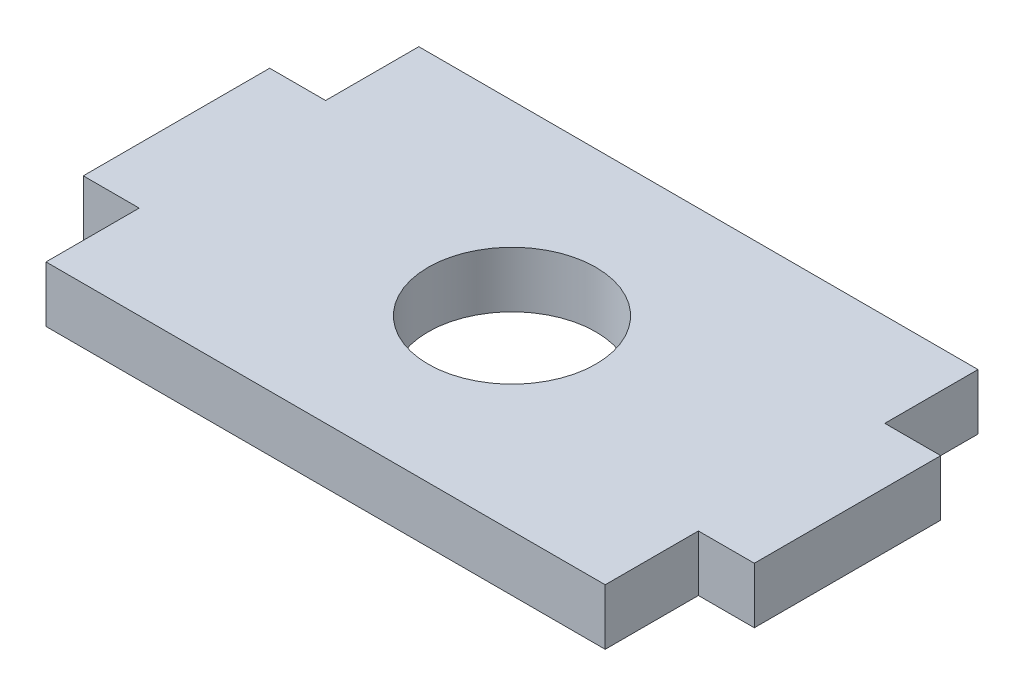
ISO-10303-21;
HEADER;
FILE_DESCRIPTION(('STEP AP214'),'2;1');
FILE_NAME('part.step','',(''),(''),'','','');
FILE_SCHEMA(('AUTOMOTIVE_DESIGN { 1 0 10303 214 1 1 1 1 }'));
ENDSEC;
DATA;
#1=APPLICATION_CONTEXT('core data for automotive mechanical design processes');
#2=APPLICATION_PROTOCOL_DEFINITION('international standard','automotive_design',2000,#1);
#3=PRODUCT_CONTEXT('',#1,'mechanical');
#4=PRODUCT('Part','Part','',(#3));
#5=PRODUCT_RELATED_PRODUCT_CATEGORY('part','',(#4));
#6=PRODUCT_DEFINITION_FORMATION('','',#4);
#7=PRODUCT_DEFINITION_CONTEXT('part definition',#1,'design');
#8=PRODUCT_DEFINITION('design','',#6,#7);
#9=PRODUCT_DEFINITION_SHAPE('','',#8);
#10=(LENGTH_UNIT() NAMED_UNIT(*) SI_UNIT(.MILLI.,.METRE.));
#11=(NAMED_UNIT(*) PLANE_ANGLE_UNIT() SI_UNIT($,.RADIAN.));
#12=(NAMED_UNIT(*) SI_UNIT($,.STERADIAN.) SOLID_ANGLE_UNIT());
#13=UNCERTAINTY_MEASURE_WITH_UNIT(LENGTH_MEASURE(1.E-05),#10,'distance_accuracy_value','');
#14=(GEOMETRIC_REPRESENTATION_CONTEXT(3) GLOBAL_UNCERTAINTY_ASSIGNED_CONTEXT((#13)) GLOBAL_UNIT_ASSIGNED_CONTEXT((#10,
#11,#12)) REPRESENTATION_CONTEXT('',''));
#15=CARTESIAN_POINT('',(0.,0.,0.));
#16=DIRECTION('',(0.,0.,1.));
#17=DIRECTION('',(1.,0.,0.));
#18=AXIS2_PLACEMENT_3D('',#15,#16,#17);
#19=CARTESIAN_POINT('',(0.,3.,0.));
#20=DIRECTION('',(0.,1.,0.));
#21=DIRECTION('',(0.,0.,1.));
#22=AXIS2_PLACEMENT_3D('',#19,#20,#21);
#23=PLANE('',#22);
#24=DIRECTION('',(-1.,0.,0.));
#25=VECTOR('',#24,1.);
#26=CARTESIAN_POINT('',(0.,3.,-5.));
#27=LINE('',#26,#25);
#28=CARTESIAN_POINT('',(3.,3.,-5.));
#29=VERTEX_POINT('',#28);
#30=CARTESIAN_POINT('',(0.,3.,-5.));
#31=VERTEX_POINT('',#30);
#32=EDGE_CURVE('E177',#29,#31,#27,.T.);
#33=ORIENTED_EDGE('',*,*,#32,.T.);
#34=DIRECTION('',(0.,0.,1.));
#35=VECTOR('',#34,1.);
#36=CARTESIAN_POINT('',(0.,3.,5.));
#37=LINE('',#36,#35);
#38=CARTESIAN_POINT('',(0.,3.,5.));
#39=VERTEX_POINT('',#38);
#40=EDGE_CURVE('E105',#31,#39,#37,.T.);
#41=ORIENTED_EDGE('',*,*,#40,.T.);
#42=DIRECTION('',(1.,0.,0.));
#43=VECTOR('',#42,1.);
#44=CARTESIAN_POINT('',(0.,3.,5.));
#45=LINE('',#44,#43);
#46=CARTESIAN_POINT('',(3.,3.,5.));
#47=VERTEX_POINT('',#46);
#48=EDGE_CURVE('E204',#39,#47,#45,.T.);
#49=ORIENTED_EDGE('',*,*,#48,.T.);
#50=DIRECTION('',(0.,0.,1.));
#51=VECTOR('',#50,1.);
#52=CARTESIAN_POINT('',(3.,3.,5.));
#53=LINE('',#52,#51);
#54=CARTESIAN_POINT('',(3.,3.,10.));
#55=VERTEX_POINT('',#54);
#56=EDGE_CURVE('E223',#47,#55,#53,.T.);
#57=ORIENTED_EDGE('',*,*,#56,.T.);
#58=DIRECTION('',(1.,0.,0.));
#59=VECTOR('',#58,1.);
#60=CARTESIAN_POINT('',(3.,3.,10.));
#61=LINE('',#60,#59);
#62=CARTESIAN_POINT('',(33.,3.,10.));
#63=VERTEX_POINT('',#62);
#64=EDGE_CURVE('E220',#55,#63,#61,.T.);
#65=ORIENTED_EDGE('',*,*,#64,.T.);
#66=DIRECTION('',(0.,0.,-1.));
#67=VECTOR('',#66,1.);
#68=CARTESIAN_POINT('',(33.,3.,5.));
#69=LINE('',#68,#67);
#70=CARTESIAN_POINT('',(33.,3.,5.));
#71=VERTEX_POINT('',#70);
#72=EDGE_CURVE('E222',#63,#71,#69,.T.);
#73=ORIENTED_EDGE('',*,*,#72,.T.);
#74=DIRECTION('',(1.,0.,0.));
#75=VECTOR('',#74,1.);
#76=CARTESIAN_POINT('',(36.,3.,5.));
#77=LINE('',#76,#75);
#78=CARTESIAN_POINT('',(36.,3.,5.));
#79=VERTEX_POINT('',#78);
#80=EDGE_CURVE('E225',#71,#79,#77,.T.);
#81=ORIENTED_EDGE('',*,*,#80,.T.);
#82=DIRECTION('',(0.,0.,-1.));
#83=VECTOR('',#82,1.);
#84=CARTESIAN_POINT('',(36.,3.,5.));
#85=LINE('',#84,#83);
#86=CARTESIAN_POINT('',(36.,3.,-5.));
#87=VERTEX_POINT('',#86);
#88=EDGE_CURVE('E231',#79,#87,#85,.T.);
#89=ORIENTED_EDGE('',*,*,#88,.T.);
#90=DIRECTION('',(-1.,0.,0.));
#91=VECTOR('',#90,1.);
#92=CARTESIAN_POINT('',(36.,3.,-5.));
#93=LINE('',#92,#91);
#94=CARTESIAN_POINT('',(33.,3.,-5.));
#95=VERTEX_POINT('',#94);
#96=EDGE_CURVE('E136',#87,#95,#93,.T.);
#97=ORIENTED_EDGE('',*,*,#96,.T.);
#98=DIRECTION('',(0.,0.,-1.));
#99=VECTOR('',#98,1.);
#100=CARTESIAN_POINT('',(33.,3.,-5.));
#101=LINE('',#100,#99);
#102=CARTESIAN_POINT('',(33.,3.,-10.));
#103=VERTEX_POINT('',#102);
#104=EDGE_CURVE('E130',#95,#103,#101,.T.);
#105=ORIENTED_EDGE('',*,*,#104,.T.);
#106=DIRECTION('',(-1.,0.,0.));
#107=VECTOR('',#106,1.);
#108=CARTESIAN_POINT('',(3.,3.,-10.));
#109=LINE('',#108,#107);
#110=CARTESIAN_POINT('',(3.,3.,-10.));
#111=VERTEX_POINT('',#110);
#112=EDGE_CURVE('E134',#103,#111,#109,.T.);
#113=ORIENTED_EDGE('',*,*,#112,.T.);
#114=DIRECTION('',(0.,0.,1.));
#115=VECTOR('',#114,1.);
#116=CARTESIAN_POINT('',(3.,3.,-5.));
#117=LINE('',#116,#115);
#118=EDGE_CURVE('E50',#111,#29,#117,.T.);
#119=ORIENTED_EDGE('',*,*,#118,.T.);
#120=EDGE_LOOP('',(#33,#41,#49,#57,#65,#73,#81,#89,#97,#105,#113,#119));
#121=FACE_BOUND('',#120,.T.);
#122=CARTESIAN_POINT('',(18.,3.,0.));
#123=DIRECTION('',(0.,1.,0.));
#124=DIRECTION('',(0.,0.,1.));
#125=AXIS2_PLACEMENT_3D('',#122,#123,#124);
#126=CIRCLE('',#125,4.5);
#127=CARTESIAN_POINT('',(18.,3.,4.5));
#128=VERTEX_POINT('',#127);
#129=EDGE_CURVE('E158',#128,#128,#126,.T.);
#130=ORIENTED_EDGE('',*,*,#129,.F.);
#131=EDGE_LOOP('',(#130));
#132=FACE_BOUND('',#131,.T.);
#133=ADVANCED_FACE('F33',(#121,#132),#23,.T.);
#134=CARTESIAN_POINT('',(0.,0.,0.));
#135=DIRECTION('',(0.,1.,0.));
#136=DIRECTION('',(0.,0.,1.));
#137=AXIS2_PLACEMENT_3D('',#134,#135,#136);
#138=PLANE('',#137);
#139=DIRECTION('',(-1.,0.,0.));
#140=VECTOR('',#139,1.);
#141=CARTESIAN_POINT('',(0.,0.,-5.));
#142=LINE('',#141,#140);
#143=CARTESIAN_POINT('',(3.,0.,-5.));
#144=VERTEX_POINT('',#143);
#145=CARTESIAN_POINT('',(0.,0.,-5.));
#146=VERTEX_POINT('',#145);
#147=EDGE_CURVE('E154',#144,#146,#142,.T.);
#148=ORIENTED_EDGE('',*,*,#147,.F.);
#149=DIRECTION('',(0.,0.,1.));
#150=VECTOR('',#149,1.);
#151=CARTESIAN_POINT('',(3.,0.,-5.));
#152=LINE('',#151,#150);
#153=CARTESIAN_POINT('',(3.,0.,-10.));
#154=VERTEX_POINT('',#153);
#155=EDGE_CURVE('E97',#154,#144,#152,.T.);
#156=ORIENTED_EDGE('',*,*,#155,.F.);
#157=DIRECTION('',(-1.,0.,0.));
#158=VECTOR('',#157,1.);
#159=CARTESIAN_POINT('',(3.,0.,-10.));
#160=LINE('',#159,#158);
#161=CARTESIAN_POINT('',(33.,0.,-10.));
#162=VERTEX_POINT('',#161);
#163=EDGE_CURVE('E91',#162,#154,#160,.T.);
#164=ORIENTED_EDGE('',*,*,#163,.F.);
#165=DIRECTION('',(0.,0.,-1.));
#166=VECTOR('',#165,1.);
#167=CARTESIAN_POINT('',(33.,0.,-5.));
#168=LINE('',#167,#166);
#169=CARTESIAN_POINT('',(33.,0.,-5.));
#170=VERTEX_POINT('',#169);
#171=EDGE_CURVE('E144',#170,#162,#168,.T.);
#172=ORIENTED_EDGE('',*,*,#171,.F.);
#173=DIRECTION('',(-1.,0.,0.));
#174=VECTOR('',#173,1.);
#175=CARTESIAN_POINT('',(36.,0.,-5.));
#176=LINE('',#175,#174);
#177=CARTESIAN_POINT('',(36.,0.,-5.));
#178=VERTEX_POINT('',#177);
#179=EDGE_CURVE('E172',#178,#170,#176,.T.);
#180=ORIENTED_EDGE('',*,*,#179,.F.);
#181=DIRECTION('',(0.,0.,-1.));
#182=VECTOR('',#181,1.);
#183=CARTESIAN_POINT('',(36.,0.,5.));
#184=LINE('',#183,#182);
#185=CARTESIAN_POINT('',(36.,0.,5.));
#186=VERTEX_POINT('',#185);
#187=EDGE_CURVE('E170',#186,#178,#184,.T.);
#188=ORIENTED_EDGE('',*,*,#187,.F.);
#189=DIRECTION('',(1.,0.,0.));
#190=VECTOR('',#189,1.);
#191=CARTESIAN_POINT('',(36.,0.,5.));
#192=LINE('',#191,#190);
#193=CARTESIAN_POINT('',(33.,0.,5.));
#194=VERTEX_POINT('',#193);
#195=EDGE_CURVE('E168',#194,#186,#192,.T.);
#196=ORIENTED_EDGE('',*,*,#195,.F.);
#197=DIRECTION('',(0.,0.,-1.));
#198=VECTOR('',#197,1.);
#199=CARTESIAN_POINT('',(33.,0.,5.));
#200=LINE('',#199,#198);
#201=CARTESIAN_POINT('',(33.,0.,10.));
#202=VERTEX_POINT('',#201);
#203=EDGE_CURVE('E166',#202,#194,#200,.T.);
#204=ORIENTED_EDGE('',*,*,#203,.F.);
#205=DIRECTION('',(1.,0.,0.));
#206=VECTOR('',#205,1.);
#207=CARTESIAN_POINT('',(3.,0.,10.));
#208=LINE('',#207,#206);
#209=CARTESIAN_POINT('',(3.,0.,10.));
#210=VERTEX_POINT('',#209);
#211=EDGE_CURVE('E164',#210,#202,#208,.T.);
#212=ORIENTED_EDGE('',*,*,#211,.F.);
#213=DIRECTION('',(0.,0.,1.));
#214=VECTOR('',#213,1.);
#215=CARTESIAN_POINT('',(3.,0.,5.));
#216=LINE('',#215,#214);
#217=CARTESIAN_POINT('',(3.,0.,5.));
#218=VERTEX_POINT('',#217);
#219=EDGE_CURVE('E162',#218,#210,#216,.T.);
#220=ORIENTED_EDGE('',*,*,#219,.F.);
#221=DIRECTION('',(1.,0.,0.));
#222=VECTOR('',#221,1.);
#223=CARTESIAN_POINT('',(0.,0.,5.));
#224=LINE('',#223,#222);
#225=CARTESIAN_POINT('',(0.,0.,5.));
#226=VERTEX_POINT('',#225);
#227=EDGE_CURVE('E160',#226,#218,#224,.T.);
#228=ORIENTED_EDGE('',*,*,#227,.F.);
#229=DIRECTION('',(0.,0.,1.));
#230=VECTOR('',#229,1.);
#231=CARTESIAN_POINT('',(0.,0.,5.));
#232=LINE('',#231,#230);
#233=EDGE_CURVE('E157',#146,#226,#232,.T.);
#234=ORIENTED_EDGE('',*,*,#233,.F.);
#235=EDGE_LOOP('',(#148,#156,#164,#172,#180,#188,#196,#204,#212,#220,#228,#234));
#236=FACE_BOUND('',#235,.T.);
#237=CARTESIAN_POINT('',(18.,0.,0.));
#238=DIRECTION('',(0.,1.,0.));
#239=DIRECTION('',(0.,0.,1.));
#240=AXIS2_PLACEMENT_3D('',#237,#238,#239);
#241=CIRCLE('',#240,4.5);
#242=CARTESIAN_POINT('',(18.,0.,4.5));
#243=VERTEX_POINT('',#242);
#244=EDGE_CURVE('E378',#243,#243,#241,.T.);
#245=ORIENTED_EDGE('',*,*,#244,.T.);
#246=EDGE_LOOP('',(#245));
#247=FACE_BOUND('',#246,.T.);
#248=ADVANCED_FACE('F208',(#236,#247),#138,.F.);
#249=CARTESIAN_POINT('',(0.,3.,-5.));
#250=DIRECTION('',(0.,0.,1.));
#251=DIRECTION('',(1.,0.,0.));
#252=AXIS2_PLACEMENT_3D('',#249,#250,#251);
#253=PLANE('',#252);
#254=ORIENTED_EDGE('',*,*,#147,.T.);
#255=DIRECTION('',(0.,-1.,0.));
#256=VECTOR('',#255,1.);
#257=CARTESIAN_POINT('',(0.,3.,-5.));
#258=LINE('',#257,#256);
#259=EDGE_CURVE('E11',#31,#146,#258,.T.);
#260=ORIENTED_EDGE('',*,*,#259,.F.);
#261=ORIENTED_EDGE('',*,*,#32,.F.);
#262=DIRECTION('',(0.,-1.,0.));
#263=VECTOR('',#262,1.);
#264=CARTESIAN_POINT('',(3.,3.,-5.));
#265=LINE('',#264,#263);
#266=EDGE_CURVE('E150',#29,#144,#265,.T.);
#267=ORIENTED_EDGE('',*,*,#266,.T.);
#268=EDGE_LOOP('',(#254,#260,#261,#267));
#269=FACE_BOUND('',#268,.T.);
#270=ADVANCED_FACE('F35',(#269),#253,.F.);
#271=CARTESIAN_POINT('',(0.,3.,5.));
#272=DIRECTION('',(1.,0.,0.));
#273=DIRECTION('',(0.,0.,-1.));
#274=AXIS2_PLACEMENT_3D('',#271,#272,#273);
#275=PLANE('',#274);
#276=ORIENTED_EDGE('',*,*,#233,.T.);
#277=DIRECTION('',(0.,-1.,0.));
#278=VECTOR('',#277,1.);
#279=CARTESIAN_POINT('',(0.,3.,5.));
#280=LINE('',#279,#278);
#281=EDGE_CURVE('E42',#39,#226,#280,.T.);
#282=ORIENTED_EDGE('',*,*,#281,.F.);
#283=ORIENTED_EDGE('',*,*,#40,.F.);
#284=ORIENTED_EDGE('',*,*,#259,.T.);
#285=EDGE_LOOP('',(#276,#282,#283,#284));
#286=FACE_BOUND('',#285,.T.);
#287=ADVANCED_FACE('F265',(#286),#275,.F.);
#288=CARTESIAN_POINT('',(0.,3.,5.));
#289=DIRECTION('',(0.,0.,-1.));
#290=DIRECTION('',(-1.,0.,0.));
#291=AXIS2_PLACEMENT_3D('',#288,#289,#290);
#292=PLANE('',#291);
#293=ORIENTED_EDGE('',*,*,#227,.T.);
#294=DIRECTION('',(0.,-1.,0.));
#295=VECTOR('',#294,1.);
#296=CARTESIAN_POINT('',(3.,3.,5.));
#297=LINE('',#296,#295);
#298=EDGE_CURVE('E196',#47,#218,#297,.T.);
#299=ORIENTED_EDGE('',*,*,#298,.F.);
#300=ORIENTED_EDGE('',*,*,#48,.F.);
#301=ORIENTED_EDGE('',*,*,#281,.T.);
#302=EDGE_LOOP('',(#293,#299,#300,#301));
#303=FACE_BOUND('',#302,.T.);
#304=ADVANCED_FACE('F202',(#303),#292,.F.);
#305=CARTESIAN_POINT('',(3.,3.,5.));
#306=DIRECTION('',(1.,0.,0.));
#307=DIRECTION('',(0.,0.,-1.));
#308=AXIS2_PLACEMENT_3D('',#305,#306,#307);
#309=PLANE('',#308);
#310=ORIENTED_EDGE('',*,*,#219,.T.);
#311=DIRECTION('',(0.,-1.,0.));
#312=VECTOR('',#311,1.);
#313=CARTESIAN_POINT('',(3.,3.,10.));
#314=LINE('',#313,#312);
#315=EDGE_CURVE('E193',#55,#210,#314,.T.);
#316=ORIENTED_EDGE('',*,*,#315,.F.);
#317=ORIENTED_EDGE('',*,*,#56,.F.);
#318=ORIENTED_EDGE('',*,*,#298,.T.);
#319=EDGE_LOOP('',(#310,#316,#317,#318));
#320=FACE_BOUND('',#319,.T.);
#321=ADVANCED_FACE('F214',(#320),#309,.F.);
#322=CARTESIAN_POINT('',(3.,3.,10.));
#323=DIRECTION('',(0.,0.,-1.));
#324=DIRECTION('',(-1.,0.,0.));
#325=AXIS2_PLACEMENT_3D('',#322,#323,#324);
#326=PLANE('',#325);
#327=ORIENTED_EDGE('',*,*,#211,.T.);
#328=DIRECTION('',(0.,-1.,0.));
#329=VECTOR('',#328,1.);
#330=CARTESIAN_POINT('',(33.,3.,10.));
#331=LINE('',#330,#329);
#332=EDGE_CURVE('E190',#63,#202,#331,.T.);
#333=ORIENTED_EDGE('',*,*,#332,.F.);
#334=ORIENTED_EDGE('',*,*,#64,.F.);
#335=ORIENTED_EDGE('',*,*,#315,.T.);
#336=EDGE_LOOP('',(#327,#333,#334,#335));
#337=FACE_BOUND('',#336,.T.);
#338=ADVANCED_FACE('F218',(#337),#326,.F.);
#339=CARTESIAN_POINT('',(33.,3.,5.));
#340=DIRECTION('',(-1.,0.,0.));
#341=DIRECTION('',(0.,0.,1.));
#342=AXIS2_PLACEMENT_3D('',#339,#340,#341);
#343=PLANE('',#342);
#344=ORIENTED_EDGE('',*,*,#203,.T.);
#345=DIRECTION('',(0.,-1.,0.));
#346=VECTOR('',#345,1.);
#347=CARTESIAN_POINT('',(33.,3.,5.));
#348=LINE('',#347,#346);
#349=EDGE_CURVE('E187',#71,#194,#348,.T.);
#350=ORIENTED_EDGE('',*,*,#349,.F.);
#351=ORIENTED_EDGE('',*,*,#72,.F.);
#352=ORIENTED_EDGE('',*,*,#332,.T.);
#353=EDGE_LOOP('',(#344,#350,#351,#352));
#354=FACE_BOUND('',#353,.T.);
#355=ADVANCED_FACE('F278',(#354),#343,.F.);
#356=CARTESIAN_POINT('',(36.,3.,5.));
#357=DIRECTION('',(0.,0.,-1.));
#358=DIRECTION('',(-1.,0.,0.));
#359=AXIS2_PLACEMENT_3D('',#356,#357,#358);
#360=PLANE('',#359);
#361=ORIENTED_EDGE('',*,*,#195,.T.);
#362=DIRECTION('',(0.,-1.,0.));
#363=VECTOR('',#362,1.);
#364=CARTESIAN_POINT('',(36.,3.,5.));
#365=LINE('',#364,#363);
#366=EDGE_CURVE('E184',#79,#186,#365,.T.);
#367=ORIENTED_EDGE('',*,*,#366,.F.);
#368=ORIENTED_EDGE('',*,*,#80,.F.);
#369=ORIENTED_EDGE('',*,*,#349,.T.);
#370=EDGE_LOOP('',(#361,#367,#368,#369));
#371=FACE_BOUND('',#370,.T.);
#372=ADVANCED_FACE('F281',(#371),#360,.F.);
#373=CARTESIAN_POINT('',(36.,3.,5.));
#374=DIRECTION('',(-1.,0.,0.));
#375=DIRECTION('',(0.,0.,1.));
#376=AXIS2_PLACEMENT_3D('',#373,#374,#375);
#377=PLANE('',#376);
#378=ORIENTED_EDGE('',*,*,#187,.T.);
#379=DIRECTION('',(0.,-1.,0.));
#380=VECTOR('',#379,1.);
#381=CARTESIAN_POINT('',(36.,3.,-5.));
#382=LINE('',#381,#380);
#383=EDGE_CURVE('E181',#87,#178,#382,.T.);
#384=ORIENTED_EDGE('',*,*,#383,.F.);
#385=ORIENTED_EDGE('',*,*,#88,.F.);
#386=ORIENTED_EDGE('',*,*,#366,.T.);
#387=EDGE_LOOP('',(#378,#384,#385,#386));
#388=FACE_BOUND('',#387,.T.);
#389=ADVANCED_FACE('F237',(#388),#377,.F.);
#390=CARTESIAN_POINT('',(36.,3.,-5.));
#391=DIRECTION('',(0.,0.,1.));
#392=DIRECTION('',(1.,0.,0.));
#393=AXIS2_PLACEMENT_3D('',#390,#391,#392);
#394=PLANE('',#393);
#395=ORIENTED_EDGE('',*,*,#179,.T.);
#396=DIRECTION('',(0.,-1.,0.));
#397=VECTOR('',#396,1.);
#398=CARTESIAN_POINT('',(33.,3.,-5.));
#399=LINE('',#398,#397);
#400=EDGE_CURVE('E145',#95,#170,#399,.T.);
#401=ORIENTED_EDGE('',*,*,#400,.F.);
#402=ORIENTED_EDGE('',*,*,#96,.F.);
#403=ORIENTED_EDGE('',*,*,#383,.T.);
#404=EDGE_LOOP('',(#395,#401,#402,#403));
#405=FACE_BOUND('',#404,.T.);
#406=ADVANCED_FACE('F241',(#405),#394,.F.);
#407=CARTESIAN_POINT('',(33.,3.,-5.));
#408=DIRECTION('',(-1.,0.,0.));
#409=DIRECTION('',(0.,0.,1.));
#410=AXIS2_PLACEMENT_3D('',#407,#408,#409);
#411=PLANE('',#410);
#412=ORIENTED_EDGE('',*,*,#171,.T.);
#413=DIRECTION('',(0.,-1.,0.));
#414=VECTOR('',#413,1.);
#415=CARTESIAN_POINT('',(33.,3.,-10.));
#416=LINE('',#415,#414);
#417=EDGE_CURVE('E141',#103,#162,#416,.T.);
#418=ORIENTED_EDGE('',*,*,#417,.F.);
#419=ORIENTED_EDGE('',*,*,#104,.F.);
#420=ORIENTED_EDGE('',*,*,#400,.T.);
#421=EDGE_LOOP('',(#412,#418,#419,#420));
#422=FACE_BOUND('',#421,.T.);
#423=ADVANCED_FACE('F142',(#422),#411,.F.);
#424=CARTESIAN_POINT('',(3.,3.,-10.));
#425=DIRECTION('',(0.,0.,1.));
#426=DIRECTION('',(1.,0.,0.));
#427=AXIS2_PLACEMENT_3D('',#424,#425,#426);
#428=PLANE('',#427);
#429=ORIENTED_EDGE('',*,*,#163,.T.);
#430=DIRECTION('',(0.,-1.,0.));
#431=VECTOR('',#430,1.);
#432=CARTESIAN_POINT('',(3.,3.,-10.));
#433=LINE('',#432,#431);
#434=EDGE_CURVE('E146',#111,#154,#433,.T.);
#435=ORIENTED_EDGE('',*,*,#434,.F.);
#436=ORIENTED_EDGE('',*,*,#112,.F.);
#437=ORIENTED_EDGE('',*,*,#417,.T.);
#438=EDGE_LOOP('',(#429,#435,#436,#437));
#439=FACE_BOUND('',#438,.T.);
#440=ADVANCED_FACE('F148',(#439),#428,.F.);
#441=CARTESIAN_POINT('',(3.,3.,-5.));
#442=DIRECTION('',(1.,0.,0.));
#443=DIRECTION('',(0.,0.,-1.));
#444=AXIS2_PLACEMENT_3D('',#441,#442,#443);
#445=PLANE('',#444);
#446=ORIENTED_EDGE('',*,*,#155,.T.);
#447=ORIENTED_EDGE('',*,*,#266,.F.);
#448=ORIENTED_EDGE('',*,*,#118,.F.);
#449=ORIENTED_EDGE('',*,*,#434,.T.);
#450=EDGE_LOOP('',(#446,#447,#448,#449));
#451=FACE_BOUND('',#450,.T.);
#452=ADVANCED_FACE('F245',(#451),#445,.F.);
#453=CARTESIAN_POINT('',(18.,3.,0.));
#454=DIRECTION('',(0.,-1.,0.));
#455=DIRECTION('',(0.,0.,-1.));
#456=AXIS2_PLACEMENT_3D('',#453,#454,#455);
#457=CYLINDRICAL_SURFACE('',#456,4.5);
#458=ORIENTED_EDGE('',*,*,#129,.T.);
#459=EDGE_LOOP('',(#458));
#460=FACE_BOUND('',#459,.T.);
#461=ORIENTED_EDGE('',*,*,#244,.F.);
#462=EDGE_LOOP('',(#461));
#463=FACE_BOUND('',#462,.T.);
#464=ADVANCED_FACE('F247',(#460,#463),#457,.F.);
#465=CLOSED_SHELL('',(#133,#248,#270,#287,#304,#321,#338,#355,#372,#389,#406,#423,#440,#452,#464));
#466=MANIFOLD_SOLID_BREP('B2',#465);
#467=ADVANCED_BREP_SHAPE_REPRESENTATION('',(#18,#466),#14);
#468=SHAPE_DEFINITION_REPRESENTATION(#9,#467);
ENDSEC;
END-ISO-10303-21;
